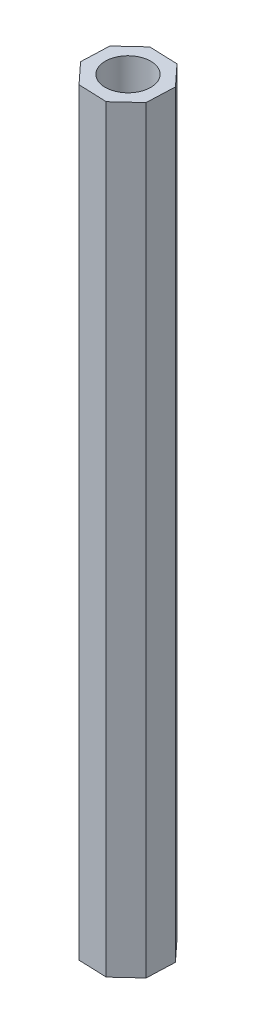
ISO-10303-21;
HEADER;
FILE_DESCRIPTION(('STEP AP214'),'2;1');
FILE_NAME('part.step','',(''),(''),'','','');
FILE_SCHEMA(('AUTOMOTIVE_DESIGN { 1 0 10303 214 1 1 1 1 }'));
ENDSEC;
DATA;
#1=APPLICATION_CONTEXT('core data for automotive mechanical design processes');
#2=APPLICATION_PROTOCOL_DEFINITION('international standard','automotive_design',2000,#1);
#3=PRODUCT_CONTEXT('',#1,'mechanical');
#4=PRODUCT('Part','Part','',(#3));
#5=PRODUCT_RELATED_PRODUCT_CATEGORY('part','',(#4));
#6=PRODUCT_DEFINITION_FORMATION('','',#4);
#7=PRODUCT_DEFINITION_CONTEXT('part definition',#1,'design');
#8=PRODUCT_DEFINITION('design','',#6,#7);
#9=PRODUCT_DEFINITION_SHAPE('','',#8);
#10=(LENGTH_UNIT() NAMED_UNIT(*) SI_UNIT(.MILLI.,.METRE.));
#11=(NAMED_UNIT(*) PLANE_ANGLE_UNIT() SI_UNIT($,.RADIAN.));
#12=(NAMED_UNIT(*) SI_UNIT($,.STERADIAN.) SOLID_ANGLE_UNIT());
#13=UNCERTAINTY_MEASURE_WITH_UNIT(LENGTH_MEASURE(1.E-05),#10,'distance_accuracy_value','');
#14=(GEOMETRIC_REPRESENTATION_CONTEXT(3) GLOBAL_UNCERTAINTY_ASSIGNED_CONTEXT((#13)) GLOBAL_UNIT_ASSIGNED_CONTEXT((#10,
#11,#12)) REPRESENTATION_CONTEXT('',''));
#15=CARTESIAN_POINT('',(0.,0.,0.));
#16=DIRECTION('',(0.,0.,1.));
#17=DIRECTION('',(1.,0.,0.));
#18=AXIS2_PLACEMENT_3D('',#15,#16,#17);
#19=CARTESIAN_POINT('',(0.,50.,0.));
#20=DIRECTION('',(0.,1.,0.));
#21=DIRECTION('',(0.,0.,1.));
#22=AXIS2_PLACEMENT_3D('',#19,#20,#21);
#23=PLANE('',#22);
#24=DIRECTION('',(0.0384929096451835,0.,-0.999258873319145));
#25=VECTOR('',#24,1.);
#26=CARTESIAN_POINT('',(2.21245782320005,50.,1.01789884641519));
#27=LINE('',#26,#25);
#28=CARTESIAN_POINT('',(2.21245782320005,50.,1.01789884641519));
#29=VERTEX_POINT('',#28);
#30=CARTESIAN_POINT('',(2.28420710673612,50.,-0.844680753011806));
#31=VERTEX_POINT('',#30);
#32=EDGE_CURVE('E153',#29,#31,#27,.T.);
#33=ORIENTED_EDGE('',*,*,#32,.T.);
#34=DIRECTION('',(-0.679364128047075,0.,-0.733801322922518));
#35=VECTOR('',#34,1.);
#36=CARTESIAN_POINT('',(2.28420710673612,50.,-0.844680753011806));
#37=LINE('',#36,#35);
#38=CARTESIAN_POINT('',(1.0178988464152,50.,-2.21245782320002));
#39=VERTEX_POINT('',#38);
#40=EDGE_CURVE('E101',#31,#39,#37,.T.);
#41=ORIENTED_EDGE('',*,*,#40,.T.);
#42=DIRECTION('',(-0.999258873319145,0.,-0.0384929096451996));
#43=VECTOR('',#42,1.);
#44=CARTESIAN_POINT('',(1.0178988464152,50.,-2.21245782320002));
#45=LINE('',#44,#43);
#46=CARTESIAN_POINT('',(-0.844680753011806,50.,-2.28420710673612));
#47=VERTEX_POINT('',#46);
#48=EDGE_CURVE('E168',#39,#47,#45,.T.);
#49=ORIENTED_EDGE('',*,*,#48,.T.);
#50=DIRECTION('',(-0.733801322922518,0.,0.679364128047075));
#51=VECTOR('',#50,1.);
#52=CARTESIAN_POINT('',(-0.844680753011806,50.,-2.28420710673612));
#53=LINE('',#52,#51);
#54=CARTESIAN_POINT('',(-2.21245782320002,50.,-1.0178988464152));
#55=VERTEX_POINT('',#54);
#56=EDGE_CURVE('E181',#47,#55,#53,.T.);
#57=ORIENTED_EDGE('',*,*,#56,.T.);
#58=DIRECTION('',(-0.0384929096452003,0.,0.999258873319145));
#59=VECTOR('',#58,1.);
#60=CARTESIAN_POINT('',(-2.21245782320002,50.,-1.0178988464152));
#61=LINE('',#60,#59);
#62=CARTESIAN_POINT('',(-2.28420710673612,50.,0.844680753011805));
#63=VERTEX_POINT('',#62);
#64=EDGE_CURVE('E120',#55,#63,#61,.T.);
#65=ORIENTED_EDGE('',*,*,#64,.T.);
#66=DIRECTION('',(0.679364128047075,0.,0.733801322922518));
#67=VECTOR('',#66,1.);
#68=CARTESIAN_POINT('',(-2.28420710673612,50.,0.844680753011805));
#69=LINE('',#68,#67);
#70=CARTESIAN_POINT('',(-1.0178988464152,50.,2.21245782320002));
#71=VERTEX_POINT('',#70);
#72=EDGE_CURVE('E114',#63,#71,#69,.T.);
#73=ORIENTED_EDGE('',*,*,#72,.T.);
#74=DIRECTION('',(0.999258873319145,0.,0.0384929096451996));
#75=VECTOR('',#74,1.);
#76=CARTESIAN_POINT('',(-1.0178988464152,50.,2.21245782320002));
#77=LINE('',#76,#75);
#78=CARTESIAN_POINT('',(0.844680753011826,50.,2.28420710673612));
#79=VERTEX_POINT('',#78);
#80=EDGE_CURVE('E118',#71,#79,#77,.T.);
#81=ORIENTED_EDGE('',*,*,#80,.T.);
#82=DIRECTION('',(0.733801322922518,0.,-0.679364128047075));
#83=VECTOR('',#82,1.);
#84=CARTESIAN_POINT('',(0.844680753011826,50.,2.28420710673612));
#85=LINE('',#84,#83);
#86=EDGE_CURVE('E58',#79,#29,#85,.T.);
#87=ORIENTED_EDGE('',*,*,#86,.T.);
#88=EDGE_LOOP('',(#33,#41,#49,#57,#65,#73,#81,#87));
#89=FACE_BOUND('',#88,.T.);
#90=CARTESIAN_POINT('',(0.,50.,0.));
#91=DIRECTION('',(0.,1.,0.));
#92=DIRECTION('',(0.,0.,1.));
#93=AXIS2_PLACEMENT_3D('',#90,#91,#92);
#94=CIRCLE('',#93,1.5);
#95=CARTESIAN_POINT('',(0.,50.,1.5));
#96=VERTEX_POINT('',#95);
#97=EDGE_CURVE('E142',#96,#96,#94,.T.);
#98=ORIENTED_EDGE('',*,*,#97,.F.);
#99=EDGE_LOOP('',(#98));
#100=FACE_BOUND('',#99,.T.);
#101=ADVANCED_FACE('F41',(#89,#100),#23,.T.);
#102=CARTESIAN_POINT('',(0.,0.,0.));
#103=DIRECTION('',(0.,1.,0.));
#104=DIRECTION('',(0.,0.,1.));
#105=AXIS2_PLACEMENT_3D('',#102,#103,#104);
#106=PLANE('',#105);
#107=DIRECTION('',(0.0384929096451835,0.,-0.999258873319145));
#108=VECTOR('',#107,1.);
#109=CARTESIAN_POINT('',(2.21245782320005,0.,1.01789884641519));
#110=LINE('',#109,#108);
#111=CARTESIAN_POINT('',(2.21245782320005,0.,1.01789884641519));
#112=VERTEX_POINT('',#111);
#113=CARTESIAN_POINT('',(2.28420710673612,0.,-0.844680753011806));
#114=VERTEX_POINT('',#113);
#115=EDGE_CURVE('E138',#112,#114,#110,.T.);
#116=ORIENTED_EDGE('',*,*,#115,.F.);
#117=DIRECTION('',(0.733801322922518,0.,-0.679364128047075));
#118=VECTOR('',#117,1.);
#119=CARTESIAN_POINT('',(0.844680753011826,0.,2.28420710673612));
#120=LINE('',#119,#118);
#121=CARTESIAN_POINT('',(0.844680753011826,0.,2.28420710673612));
#122=VERTEX_POINT('',#121);
#123=EDGE_CURVE('E93',#122,#112,#120,.T.);
#124=ORIENTED_EDGE('',*,*,#123,.F.);
#125=DIRECTION('',(0.999258873319145,0.,0.0384929096451996));
#126=VECTOR('',#125,1.);
#127=CARTESIAN_POINT('',(-1.0178988464152,0.,2.21245782320002));
#128=LINE('',#127,#126);
#129=CARTESIAN_POINT('',(-1.0178988464152,0.,2.21245782320002));
#130=VERTEX_POINT('',#129);
#131=EDGE_CURVE('E87',#130,#122,#128,.T.);
#132=ORIENTED_EDGE('',*,*,#131,.F.);
#133=DIRECTION('',(0.679364128047075,0.,0.733801322922518));
#134=VECTOR('',#133,1.);
#135=CARTESIAN_POINT('',(-2.28420710673612,0.,0.844680753011805));
#136=LINE('',#135,#134);
#137=CARTESIAN_POINT('',(-2.28420710673612,0.,0.844680753011805));
#138=VERTEX_POINT('',#137);
#139=EDGE_CURVE('E128',#138,#130,#136,.T.);
#140=ORIENTED_EDGE('',*,*,#139,.F.);
#141=DIRECTION('',(-0.0384929096452003,0.,0.999258873319145));
#142=VECTOR('',#141,1.);
#143=CARTESIAN_POINT('',(-2.21245782320002,0.,-1.0178988464152));
#144=LINE('',#143,#142);
#145=CARTESIAN_POINT('',(-2.21245782320002,0.,-1.0178988464152));
#146=VERTEX_POINT('',#145);
#147=EDGE_CURVE('E148',#146,#138,#144,.T.);
#148=ORIENTED_EDGE('',*,*,#147,.F.);
#149=DIRECTION('',(-0.733801322922518,0.,0.679364128047075));
#150=VECTOR('',#149,1.);
#151=CARTESIAN_POINT('',(-0.844680753011806,0.,-2.28420710673612));
#152=LINE('',#151,#150);
#153=CARTESIAN_POINT('',(-0.844680753011806,0.,-2.28420710673612));
#154=VERTEX_POINT('',#153);
#155=EDGE_CURVE('E146',#154,#146,#152,.T.);
#156=ORIENTED_EDGE('',*,*,#155,.F.);
#157=DIRECTION('',(-0.999258873319145,0.,-0.0384929096451996));
#158=VECTOR('',#157,1.);
#159=CARTESIAN_POINT('',(1.0178988464152,0.,-2.21245782320002));
#160=LINE('',#159,#158);
#161=CARTESIAN_POINT('',(1.0178988464152,0.,-2.21245782320002));
#162=VERTEX_POINT('',#161);
#163=EDGE_CURVE('E144',#162,#154,#160,.T.);
#164=ORIENTED_EDGE('',*,*,#163,.F.);
#165=DIRECTION('',(-0.679364128047075,0.,-0.733801322922518));
#166=VECTOR('',#165,1.);
#167=CARTESIAN_POINT('',(2.28420710673612,0.,-0.844680753011806));
#168=LINE('',#167,#166);
#169=EDGE_CURVE('E141',#114,#162,#168,.T.);
#170=ORIENTED_EDGE('',*,*,#169,.F.);
#171=EDGE_LOOP('',(#116,#124,#132,#140,#148,#156,#164,#170));
#172=FACE_BOUND('',#171,.T.);
#173=CARTESIAN_POINT('',(0.,0.,0.));
#174=DIRECTION('',(0.,1.,0.));
#175=DIRECTION('',(0.,0.,1.));
#176=AXIS2_PLACEMENT_3D('',#173,#174,#175);
#177=CIRCLE('',#176,1.5);
#178=CARTESIAN_POINT('',(0.,0.,1.5));
#179=VERTEX_POINT('',#178);
#180=EDGE_CURVE('E187',#179,#179,#177,.T.);
#181=ORIENTED_EDGE('',*,*,#180,.T.);
#182=EDGE_LOOP('',(#181));
#183=FACE_BOUND('',#182,.T.);
#184=ADVANCED_FACE('F172',(#172,#183),#106,.F.);
#185=CARTESIAN_POINT('',(2.21245782320005,50.,1.01789884641519));
#186=DIRECTION('',(-0.999258873319145,0.,-0.0384929096451835));
#187=DIRECTION('',(-0.0384929096451835,0.,0.999258873319145));
#188=AXIS2_PLACEMENT_3D('',#185,#186,#187);
#189=PLANE('',#188);
#190=ORIENTED_EDGE('',*,*,#115,.T.);
#191=DIRECTION('',(0.,-1.,0.));
#192=VECTOR('',#191,1.);
#193=CARTESIAN_POINT('',(2.28420710673612,50.,-0.844680753011806));
#194=LINE('',#193,#192);
#195=EDGE_CURVE('E11',#31,#114,#194,.T.);
#196=ORIENTED_EDGE('',*,*,#195,.F.);
#197=ORIENTED_EDGE('',*,*,#32,.F.);
#198=DIRECTION('',(0.,-1.,0.));
#199=VECTOR('',#198,1.);
#200=CARTESIAN_POINT('',(2.21245782320005,50.,1.01789884641519));
#201=LINE('',#200,#199);
#202=EDGE_CURVE('E134',#29,#112,#201,.T.);
#203=ORIENTED_EDGE('',*,*,#202,.T.);
#204=EDGE_LOOP('',(#190,#196,#197,#203));
#205=FACE_BOUND('',#204,.T.);
#206=ADVANCED_FACE('F43',(#205),#189,.F.);
#207=CARTESIAN_POINT('',(2.28420710673612,50.,-0.844680753011806));
#208=DIRECTION('',(-0.733801322922518,0.,0.679364128047075));
#209=DIRECTION('',(0.679364128047075,0.,0.733801322922518));
#210=AXIS2_PLACEMENT_3D('',#207,#208,#209);
#211=PLANE('',#210);
#212=ORIENTED_EDGE('',*,*,#169,.T.);
#213=DIRECTION('',(0.,-1.,0.));
#214=VECTOR('',#213,1.);
#215=CARTESIAN_POINT('',(1.0178988464152,50.,-2.21245782320002));
#216=LINE('',#215,#214);
#217=EDGE_CURVE('E50',#39,#162,#216,.T.);
#218=ORIENTED_EDGE('',*,*,#217,.F.);
#219=ORIENTED_EDGE('',*,*,#40,.F.);
#220=ORIENTED_EDGE('',*,*,#195,.T.);
#221=EDGE_LOOP('',(#212,#218,#219,#220));
#222=FACE_BOUND('',#221,.T.);
#223=ADVANCED_FACE('F215',(#222),#211,.F.);
#224=CARTESIAN_POINT('',(1.0178988464152,50.,-2.21245782320002));
#225=DIRECTION('',(-0.0384929096451996,0.,0.999258873319145));
#226=DIRECTION('',(0.999258873319145,0.,0.0384929096451996));
#227=AXIS2_PLACEMENT_3D('',#224,#225,#226);
#228=PLANE('',#227);
#229=ORIENTED_EDGE('',*,*,#163,.T.);
#230=DIRECTION('',(0.,-1.,0.));
#231=VECTOR('',#230,1.);
#232=CARTESIAN_POINT('',(-0.844680753011806,50.,-2.28420710673612));
#233=LINE('',#232,#231);
#234=EDGE_CURVE('E160',#47,#154,#233,.T.);
#235=ORIENTED_EDGE('',*,*,#234,.F.);
#236=ORIENTED_EDGE('',*,*,#48,.F.);
#237=ORIENTED_EDGE('',*,*,#217,.T.);
#238=EDGE_LOOP('',(#229,#235,#236,#237));
#239=FACE_BOUND('',#238,.T.);
#240=ADVANCED_FACE('F166',(#239),#228,.F.);
#241=CARTESIAN_POINT('',(-0.844680753011806,50.,-2.28420710673612));
#242=DIRECTION('',(0.679364128047075,0.,0.733801322922518));
#243=DIRECTION('',(0.733801322922518,0.,-0.679364128047075));
#244=AXIS2_PLACEMENT_3D('',#241,#242,#243);
#245=PLANE('',#244);
#246=ORIENTED_EDGE('',*,*,#155,.T.);
#247=DIRECTION('',(0.,-1.,0.));
#248=VECTOR('',#247,1.);
#249=CARTESIAN_POINT('',(-2.21245782320002,50.,-1.0178988464152));
#250=LINE('',#249,#248);
#251=EDGE_CURVE('E157',#55,#146,#250,.T.);
#252=ORIENTED_EDGE('',*,*,#251,.F.);
#253=ORIENTED_EDGE('',*,*,#56,.F.);
#254=ORIENTED_EDGE('',*,*,#234,.T.);
#255=EDGE_LOOP('',(#246,#252,#253,#254));
#256=FACE_BOUND('',#255,.T.);
#257=ADVANCED_FACE('F177',(#256),#245,.F.);
#258=CARTESIAN_POINT('',(-2.21245782320002,50.,-1.0178988464152));
#259=DIRECTION('',(0.999258873319145,0.,0.0384929096452003));
#260=DIRECTION('',(0.0384929096452003,0.,-0.999258873319145));
#261=AXIS2_PLACEMENT_3D('',#258,#259,#260);
#262=PLANE('',#261);
#263=ORIENTED_EDGE('',*,*,#147,.T.);
#264=DIRECTION('',(0.,-1.,0.));
#265=VECTOR('',#264,1.);
#266=CARTESIAN_POINT('',(-2.28420710673612,50.,0.844680753011805));
#267=LINE('',#266,#265);
#268=EDGE_CURVE('E129',#63,#138,#267,.T.);
#269=ORIENTED_EDGE('',*,*,#268,.F.);
#270=ORIENTED_EDGE('',*,*,#64,.F.);
#271=ORIENTED_EDGE('',*,*,#251,.T.);
#272=EDGE_LOOP('',(#263,#269,#270,#271));
#273=FACE_BOUND('',#272,.T.);
#274=ADVANCED_FACE('F180',(#273),#262,.F.);
#275=CARTESIAN_POINT('',(-2.28420710673612,50.,0.844680753011805));
#276=DIRECTION('',(0.733801322922518,0.,-0.679364128047075));
#277=DIRECTION('',(-0.679364128047075,0.,-0.733801322922518));
#278=AXIS2_PLACEMENT_3D('',#275,#276,#277);
#279=PLANE('',#278);
#280=ORIENTED_EDGE('',*,*,#139,.T.);
#281=DIRECTION('',(0.,-1.,0.));
#282=VECTOR('',#281,1.);
#283=CARTESIAN_POINT('',(-1.0178988464152,50.,2.21245782320002));
#284=LINE('',#283,#282);
#285=EDGE_CURVE('E125',#71,#130,#284,.T.);
#286=ORIENTED_EDGE('',*,*,#285,.F.);
#287=ORIENTED_EDGE('',*,*,#72,.F.);
#288=ORIENTED_EDGE('',*,*,#268,.T.);
#289=EDGE_LOOP('',(#280,#286,#287,#288));
#290=FACE_BOUND('',#289,.T.);
#291=ADVANCED_FACE('F126',(#290),#279,.F.);
#292=CARTESIAN_POINT('',(-1.0178988464152,50.,2.21245782320002));
#293=DIRECTION('',(0.0384929096451996,0.,-0.999258873319145));
#294=DIRECTION('',(-0.999258873319145,0.,-0.0384929096451996));
#295=AXIS2_PLACEMENT_3D('',#292,#293,#294);
#296=PLANE('',#295);
#297=ORIENTED_EDGE('',*,*,#131,.T.);
#298=DIRECTION('',(0.,-1.,0.));
#299=VECTOR('',#298,1.);
#300=CARTESIAN_POINT('',(0.844680753011826,50.,2.28420710673612));
#301=LINE('',#300,#299);
#302=EDGE_CURVE('E130',#79,#122,#301,.T.);
#303=ORIENTED_EDGE('',*,*,#302,.F.);
#304=ORIENTED_EDGE('',*,*,#80,.F.);
#305=ORIENTED_EDGE('',*,*,#285,.T.);
#306=EDGE_LOOP('',(#297,#303,#304,#305));
#307=FACE_BOUND('',#306,.T.);
#308=ADVANCED_FACE('F132',(#307),#296,.F.);
#309=CARTESIAN_POINT('',(0.844680753011826,50.,2.28420710673612));
#310=DIRECTION('',(-0.679364128047075,0.,-0.733801322922518));
#311=DIRECTION('',(-0.733801322922518,0.,0.679364128047075));
#312=AXIS2_PLACEMENT_3D('',#309,#310,#311);
#313=PLANE('',#312);
#314=ORIENTED_EDGE('',*,*,#123,.T.);
#315=ORIENTED_EDGE('',*,*,#202,.F.);
#316=ORIENTED_EDGE('',*,*,#86,.F.);
#317=ORIENTED_EDGE('',*,*,#302,.T.);
#318=EDGE_LOOP('',(#314,#315,#316,#317));
#319=FACE_BOUND('',#318,.T.);
#320=ADVANCED_FACE('F203',(#319),#313,.F.);
#321=CARTESIAN_POINT('',(0.,50.,0.));
#322=DIRECTION('',(0.,-1.,0.));
#323=DIRECTION('',(0.,0.,-1.));
#324=AXIS2_PLACEMENT_3D('',#321,#322,#323);
#325=CYLINDRICAL_SURFACE('',#324,1.5);
#326=ORIENTED_EDGE('',*,*,#97,.T.);
#327=EDGE_LOOP('',(#326));
#328=FACE_BOUND('',#327,.T.);
#329=ORIENTED_EDGE('',*,*,#180,.F.);
#330=EDGE_LOOP('',(#329));
#331=FACE_BOUND('',#330,.T.);
#332=ADVANCED_FACE('F193',(#328,#331),#325,.F.);
#333=CLOSED_SHELL('',(#101,#184,#206,#223,#240,#257,#274,#291,#308,#320,#332));
#334=MANIFOLD_SOLID_BREP('B2',#333);
#335=ADVANCED_BREP_SHAPE_REPRESENTATION('',(#18,#334),#14);
#336=SHAPE_DEFINITION_REPRESENTATION(#9,#335);
ENDSEC;
END-ISO-10303-21;
